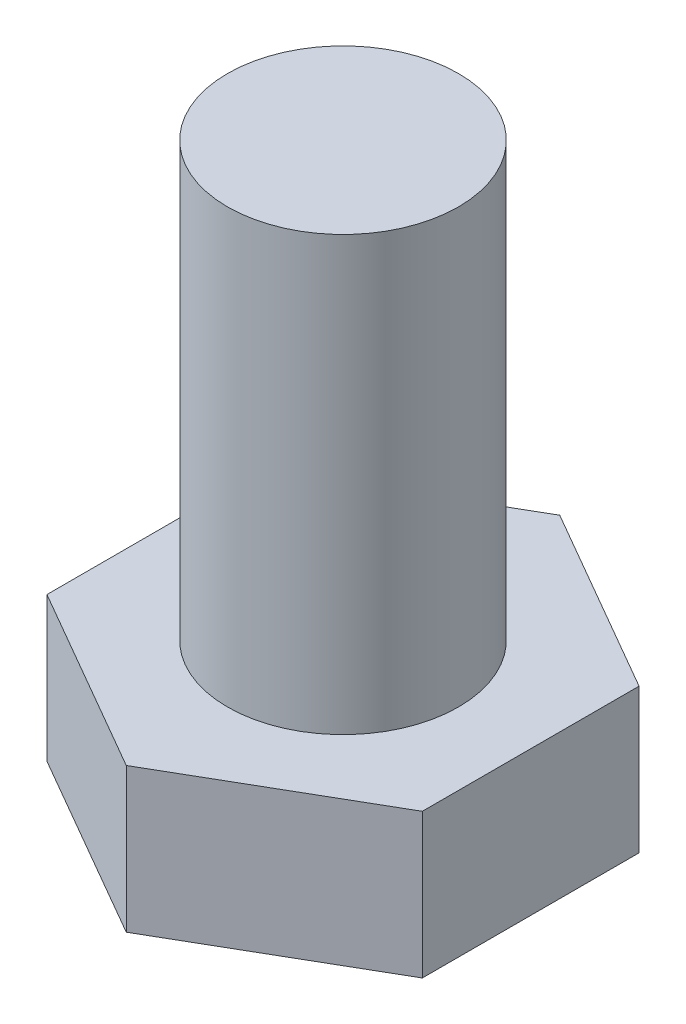
ISO-10303-21;
HEADER;
FILE_DESCRIPTION(('STEP AP214'),'2;1');
FILE_NAME('part.step','',(''),(''),'','','');
FILE_SCHEMA(('AUTOMOTIVE_DESIGN { 1 0 10303 214 1 1 1 1 }'));
ENDSEC;
DATA;
#1=APPLICATION_CONTEXT('core data for automotive mechanical design processes');
#2=APPLICATION_PROTOCOL_DEFINITION('international standard','automotive_design',2000,#1);
#3=PRODUCT_CONTEXT('',#1,'mechanical');
#4=PRODUCT('Part','Part','',(#3));
#5=PRODUCT_RELATED_PRODUCT_CATEGORY('part','',(#4));
#6=PRODUCT_DEFINITION_FORMATION('','',#4);
#7=PRODUCT_DEFINITION_CONTEXT('part definition',#1,'design');
#8=PRODUCT_DEFINITION('design','',#6,#7);
#9=PRODUCT_DEFINITION_SHAPE('','',#8);
#10=(LENGTH_UNIT() NAMED_UNIT(*) SI_UNIT(.MILLI.,.METRE.));
#11=(NAMED_UNIT(*) PLANE_ANGLE_UNIT() SI_UNIT($,.RADIAN.));
#12=(NAMED_UNIT(*) SI_UNIT($,.STERADIAN.) SOLID_ANGLE_UNIT());
#13=UNCERTAINTY_MEASURE_WITH_UNIT(LENGTH_MEASURE(1.E-05),#10,'distance_accuracy_value','');
#14=(GEOMETRIC_REPRESENTATION_CONTEXT(3) GLOBAL_UNCERTAINTY_ASSIGNED_CONTEXT((#13)) GLOBAL_UNIT_ASSIGNED_CONTEXT((#10,
#11,#12)) REPRESENTATION_CONTEXT('',''));
#15=CARTESIAN_POINT('',(0.,0.,0.));
#16=DIRECTION('',(0.,0.,1.));
#17=DIRECTION('',(1.,0.,0.));
#18=AXIS2_PLACEMENT_3D('',#15,#16,#17);
#19=CARTESIAN_POINT('',(6.5,5.,-3.75277674973257));
#20=DIRECTION('',(-0.5,0.,0.866025403784438));
#21=DIRECTION('',(0.866025403784439,0.,0.5));
#22=AXIS2_PLACEMENT_3D('',#19,#20,#21);
#23=PLANE('',#22);
#24=DIRECTION('',(-0.866025403784439,0.,-0.5));
#25=VECTOR('',#24,1.);
#26=CARTESIAN_POINT('',(6.5,0.,-3.75277674973257));
#27=LINE('',#26,#25);
#28=CARTESIAN_POINT('',(6.5,0.,-3.75277674973257));
#29=VERTEX_POINT('',#28);
#30=CARTESIAN_POINT('',(0.,0.,-7.50555349946514));
#31=VERTEX_POINT('',#30);
#32=EDGE_CURVE('E120',#29,#31,#27,.T.);
#33=ORIENTED_EDGE('',*,*,#32,.T.);
#34=DIRECTION('',(0.,-1.,0.));
#35=VECTOR('',#34,1.);
#36=CARTESIAN_POINT('',(0.,5.,-7.50555349946514));
#37=LINE('',#36,#35);
#38=CARTESIAN_POINT('',(0.,5.,-7.50555349946514));
#39=VERTEX_POINT('',#38);
#40=EDGE_CURVE('E37',#39,#31,#37,.T.);
#41=ORIENTED_EDGE('',*,*,#40,.F.);
#42=DIRECTION('',(-0.866025403784439,0.,-0.5));
#43=VECTOR('',#42,1.);
#44=CARTESIAN_POINT('',(6.5,5.,-3.75277674973257));
#45=LINE('',#44,#43);
#46=CARTESIAN_POINT('',(6.5,5.,-3.75277674973257));
#47=VERTEX_POINT('',#46);
#48=EDGE_CURVE('E131',#47,#39,#45,.T.);
#49=ORIENTED_EDGE('',*,*,#48,.F.);
#50=DIRECTION('',(0.,-1.,0.));
#51=VECTOR('',#50,1.);
#52=CARTESIAN_POINT('',(6.5,5.,-3.75277674973257));
#53=LINE('',#52,#51);
#54=EDGE_CURVE('E116',#47,#29,#53,.T.);
#55=ORIENTED_EDGE('',*,*,#54,.T.);
#56=EDGE_LOOP('',(#33,#41,#49,#55));
#57=FACE_BOUND('',#56,.T.);
#58=ADVANCED_FACE('F34',(#57),#23,.F.);
#59=CARTESIAN_POINT('',(0.,5.,-7.50555349946514));
#60=DIRECTION('',(0.5,0.,0.866025403784439));
#61=DIRECTION('',(0.866025403784439,0.,-0.5));
#62=AXIS2_PLACEMENT_3D('',#59,#60,#61);
#63=PLANE('',#62);
#64=DIRECTION('',(-0.866025403784439,0.,0.5));
#65=VECTOR('',#64,1.);
#66=CARTESIAN_POINT('',(0.,0.,-7.50555349946514));
#67=LINE('',#66,#65);
#68=CARTESIAN_POINT('',(-6.5,0.,-3.75277674973257));
#69=VERTEX_POINT('',#68);
#70=EDGE_CURVE('E123',#31,#69,#67,.T.);
#71=ORIENTED_EDGE('',*,*,#70,.T.);
#72=DIRECTION('',(0.,-1.,0.));
#73=VECTOR('',#72,1.);
#74=CARTESIAN_POINT('',(-6.5,5.,-3.75277674973257));
#75=LINE('',#74,#73);
#76=CARTESIAN_POINT('',(-6.5,5.,-3.75277674973257));
#77=VERTEX_POINT('',#76);
#78=EDGE_CURVE('E134',#77,#69,#75,.T.);
#79=ORIENTED_EDGE('',*,*,#78,.F.);
#80=DIRECTION('',(-0.866025403784439,0.,0.5));
#81=VECTOR('',#80,1.);
#82=CARTESIAN_POINT('',(0.,5.,-7.50555349946514));
#83=LINE('',#82,#81);
#84=EDGE_CURVE('E89',#39,#77,#83,.T.);
#85=ORIENTED_EDGE('',*,*,#84,.F.);
#86=ORIENTED_EDGE('',*,*,#40,.T.);
#87=EDGE_LOOP('',(#71,#79,#85,#86));
#88=FACE_BOUND('',#87,.T.);
#89=ADVANCED_FACE('F139',(#88),#63,.F.);
#90=CARTESIAN_POINT('',(-6.5,5.,-3.75277674973257));
#91=DIRECTION('',(1.,0.,0.));
#92=DIRECTION('',(0.,0.,-1.));
#93=AXIS2_PLACEMENT_3D('',#90,#91,#92);
#94=PLANE('',#93);
#95=DIRECTION('',(0.,0.,1.));
#96=VECTOR('',#95,1.);
#97=CARTESIAN_POINT('',(-6.5,0.,-3.75277674973257));
#98=LINE('',#97,#96);
#99=CARTESIAN_POINT('',(-6.5,0.,3.75277674973257));
#100=VERTEX_POINT('',#99);
#101=EDGE_CURVE('E126',#69,#100,#98,.T.);
#102=ORIENTED_EDGE('',*,*,#101,.T.);
#103=DIRECTION('',(0.,-1.,0.));
#104=VECTOR('',#103,1.);
#105=CARTESIAN_POINT('',(-6.5,5.,3.75277674973257));
#106=LINE('',#105,#104);
#107=CARTESIAN_POINT('',(-6.5,5.,3.75277674973257));
#108=VERTEX_POINT('',#107);
#109=EDGE_CURVE('E111',#108,#100,#106,.T.);
#110=ORIENTED_EDGE('',*,*,#109,.F.);
#111=DIRECTION('',(0.,0.,1.));
#112=VECTOR('',#111,1.);
#113=CARTESIAN_POINT('',(-6.5,5.,-3.75277674973257));
#114=LINE('',#113,#112);
#115=EDGE_CURVE('E102',#77,#108,#114,.T.);
#116=ORIENTED_EDGE('',*,*,#115,.F.);
#117=ORIENTED_EDGE('',*,*,#78,.T.);
#118=EDGE_LOOP('',(#102,#110,#116,#117));
#119=FACE_BOUND('',#118,.T.);
#120=ADVANCED_FACE('F145',(#119),#94,.F.);
#121=CARTESIAN_POINT('',(-6.5,5.,3.75277674973257));
#122=DIRECTION('',(0.5,0.,-0.866025403784439));
#123=DIRECTION('',(-0.866025403784439,0.,-0.5));
#124=AXIS2_PLACEMENT_3D('',#121,#122,#123);
#125=PLANE('',#124);
#126=DIRECTION('',(0.866025403784439,0.,0.5));
#127=VECTOR('',#126,1.);
#128=CARTESIAN_POINT('',(-6.5,0.,3.75277674973257));
#129=LINE('',#128,#127);
#130=CARTESIAN_POINT('',(0.,0.,7.50555349946514));
#131=VERTEX_POINT('',#130);
#132=EDGE_CURVE('E110',#100,#131,#129,.T.);
#133=ORIENTED_EDGE('',*,*,#132,.T.);
#134=DIRECTION('',(0.,-1.,0.));
#135=VECTOR('',#134,1.);
#136=CARTESIAN_POINT('',(0.,5.,7.50555349946514));
#137=LINE('',#136,#135);
#138=CARTESIAN_POINT('',(0.,5.,7.50555349946514));
#139=VERTEX_POINT('',#138);
#140=EDGE_CURVE('E107',#139,#131,#137,.T.);
#141=ORIENTED_EDGE('',*,*,#140,.F.);
#142=DIRECTION('',(0.866025403784439,0.,0.5));
#143=VECTOR('',#142,1.);
#144=CARTESIAN_POINT('',(-6.5,5.,3.75277674973257));
#145=LINE('',#144,#143);
#146=EDGE_CURVE('E96',#108,#139,#145,.T.);
#147=ORIENTED_EDGE('',*,*,#146,.F.);
#148=ORIENTED_EDGE('',*,*,#109,.T.);
#149=EDGE_LOOP('',(#133,#141,#147,#148));
#150=FACE_BOUND('',#149,.T.);
#151=ADVANCED_FACE('F108',(#150),#125,.F.);
#152=CARTESIAN_POINT('',(0.,5.,7.50555349946514));
#153=DIRECTION('',(-0.5,0.,-0.866025403784439));
#154=DIRECTION('',(-0.866025403784439,0.,0.5));
#155=AXIS2_PLACEMENT_3D('',#152,#153,#154);
#156=PLANE('',#155);
#157=DIRECTION('',(0.866025403784439,0.,-0.5));
#158=VECTOR('',#157,1.);
#159=CARTESIAN_POINT('',(0.,0.,7.50555349946514));
#160=LINE('',#159,#158);
#161=CARTESIAN_POINT('',(6.5,0.,3.75277674973257));
#162=VERTEX_POINT('',#161);
#163=EDGE_CURVE('E74',#131,#162,#160,.T.);
#164=ORIENTED_EDGE('',*,*,#163,.T.);
#165=DIRECTION('',(0.,-1.,0.));
#166=VECTOR('',#165,1.);
#167=CARTESIAN_POINT('',(6.5,5.,3.75277674973257));
#168=LINE('',#167,#166);
#169=CARTESIAN_POINT('',(6.5,5.,3.75277674973257));
#170=VERTEX_POINT('',#169);
#171=EDGE_CURVE('E112',#170,#162,#168,.T.);
#172=ORIENTED_EDGE('',*,*,#171,.F.);
#173=DIRECTION('',(0.866025403784439,0.,-0.5));
#174=VECTOR('',#173,1.);
#175=CARTESIAN_POINT('',(0.,5.,7.50555349946514));
#176=LINE('',#175,#174);
#177=EDGE_CURVE('E100',#139,#170,#176,.T.);
#178=ORIENTED_EDGE('',*,*,#177,.F.);
#179=ORIENTED_EDGE('',*,*,#140,.T.);
#180=EDGE_LOOP('',(#164,#172,#178,#179));
#181=FACE_BOUND('',#180,.T.);
#182=ADVANCED_FACE('F114',(#181),#156,.F.);
#183=CARTESIAN_POINT('',(6.5,5.,3.75277674973257));
#184=DIRECTION('',(-1.,0.,0.));
#185=DIRECTION('',(0.,0.,1.));
#186=AXIS2_PLACEMENT_3D('',#183,#184,#185);
#187=PLANE('',#186);
#188=DIRECTION('',(0.,0.,-1.));
#189=VECTOR('',#188,1.);
#190=CARTESIAN_POINT('',(6.5,0.,3.75277674973257));
#191=LINE('',#190,#189);
#192=EDGE_CURVE('E80',#162,#29,#191,.T.);
#193=ORIENTED_EDGE('',*,*,#192,.T.);
#194=ORIENTED_EDGE('',*,*,#54,.F.);
#195=DIRECTION('',(0.,0.,-1.));
#196=VECTOR('',#195,1.);
#197=CARTESIAN_POINT('',(6.5,5.,3.75277674973257));
#198=LINE('',#197,#196);
#199=EDGE_CURVE('E51',#170,#47,#198,.T.);
#200=ORIENTED_EDGE('',*,*,#199,.F.);
#201=ORIENTED_EDGE('',*,*,#171,.T.);
#202=EDGE_LOOP('',(#193,#194,#200,#201));
#203=FACE_BOUND('',#202,.T.);
#204=ADVANCED_FACE('F161',(#203),#187,.F.);
#205=CARTESIAN_POINT('',(0.,5.,0.));
#206=DIRECTION('',(0.,1.,0.));
#207=DIRECTION('',(0.,0.,1.));
#208=AXIS2_PLACEMENT_3D('',#205,#206,#207);
#209=PLANE('',#208);
#210=CARTESIAN_POINT('',(0.,5.,0.));
#211=DIRECTION('',(0.,1.,0.));
#212=DIRECTION('',(0.,0.,1.));
#213=AXIS2_PLACEMENT_3D('',#210,#211,#212);
#214=CIRCLE('',#213,4.);
#215=CARTESIAN_POINT('',(0.,5.,4.));
#216=VERTEX_POINT('',#215);
#217=EDGE_CURVE('E11',#216,#216,#214,.T.);
#218=ORIENTED_EDGE('',*,*,#217,.F.);
#219=EDGE_LOOP('',(#218));
#220=FACE_BOUND('',#219,.T.);
#221=ORIENTED_EDGE('',*,*,#48,.T.);
#222=ORIENTED_EDGE('',*,*,#84,.T.);
#223=ORIENTED_EDGE('',*,*,#115,.T.);
#224=ORIENTED_EDGE('',*,*,#146,.T.);
#225=ORIENTED_EDGE('',*,*,#177,.T.);
#226=ORIENTED_EDGE('',*,*,#199,.T.);
#227=EDGE_LOOP('',(#221,#222,#223,#224,#225,#226));
#228=FACE_BOUND('',#227,.T.);
#229=ADVANCED_FACE('F98',(#220,#228),#209,.T.);
#230=CARTESIAN_POINT('',(0.,0.,0.));
#231=DIRECTION('',(0.,1.,0.));
#232=DIRECTION('',(0.,0.,1.));
#233=AXIS2_PLACEMENT_3D('',#230,#231,#232);
#234=PLANE('',#233);
#235=ORIENTED_EDGE('',*,*,#32,.F.);
#236=ORIENTED_EDGE('',*,*,#192,.F.);
#237=ORIENTED_EDGE('',*,*,#163,.F.);
#238=ORIENTED_EDGE('',*,*,#132,.F.);
#239=ORIENTED_EDGE('',*,*,#101,.F.);
#240=ORIENTED_EDGE('',*,*,#70,.F.);
#241=EDGE_LOOP('',(#235,#236,#237,#238,#239,#240));
#242=FACE_BOUND('',#241,.T.);
#243=ADVANCED_FACE('F144',(#242),#234,.F.);
#244=CARTESIAN_POINT('',(0.,20.,0.));
#245=DIRECTION('',(0.,-1.,0.));
#246=DIRECTION('',(0.,0.,-1.));
#247=AXIS2_PLACEMENT_3D('',#244,#245,#246);
#248=CYLINDRICAL_SURFACE('',#247,4.);
#249=CARTESIAN_POINT('',(0.,20.,0.));
#250=DIRECTION('',(0.,1.,0.));
#251=DIRECTION('',(0.,0.,1.));
#252=AXIS2_PLACEMENT_3D('',#249,#250,#251);
#253=CIRCLE('',#252,4.);
#254=CARTESIAN_POINT('',(0.,20.,4.));
#255=VERTEX_POINT('',#254);
#256=EDGE_CURVE('E124',#255,#255,#253,.T.);
#257=ORIENTED_EDGE('',*,*,#256,.F.);
#258=EDGE_LOOP('',(#257));
#259=FACE_BOUND('',#258,.T.);
#260=ORIENTED_EDGE('',*,*,#217,.T.);
#261=EDGE_LOOP('',(#260));
#262=FACE_BOUND('',#261,.T.);
#263=ADVANCED_FACE('F154',(#259,#262),#248,.T.);
#264=CARTESIAN_POINT('',(0.,20.,0.));
#265=DIRECTION('',(0.,1.,0.));
#266=DIRECTION('',(0.,0.,1.));
#267=AXIS2_PLACEMENT_3D('',#264,#265,#266);
#268=PLANE('',#267);
#269=ORIENTED_EDGE('',*,*,#256,.T.);
#270=EDGE_LOOP('',(#269));
#271=FACE_BOUND('',#270,.T.);
#272=ADVANCED_FACE('F152',(#271),#268,.T.);
#273=CLOSED_SHELL('',(#58,#89,#120,#151,#182,#204,#229,#243,#263,#272));
#274=MANIFOLD_SOLID_BREP('B2',#273);
#275=ADVANCED_BREP_SHAPE_REPRESENTATION('',(#18,#274),#14);
#276=SHAPE_DEFINITION_REPRESENTATION(#9,#275);
ENDSEC;
END-ISO-10303-21;
